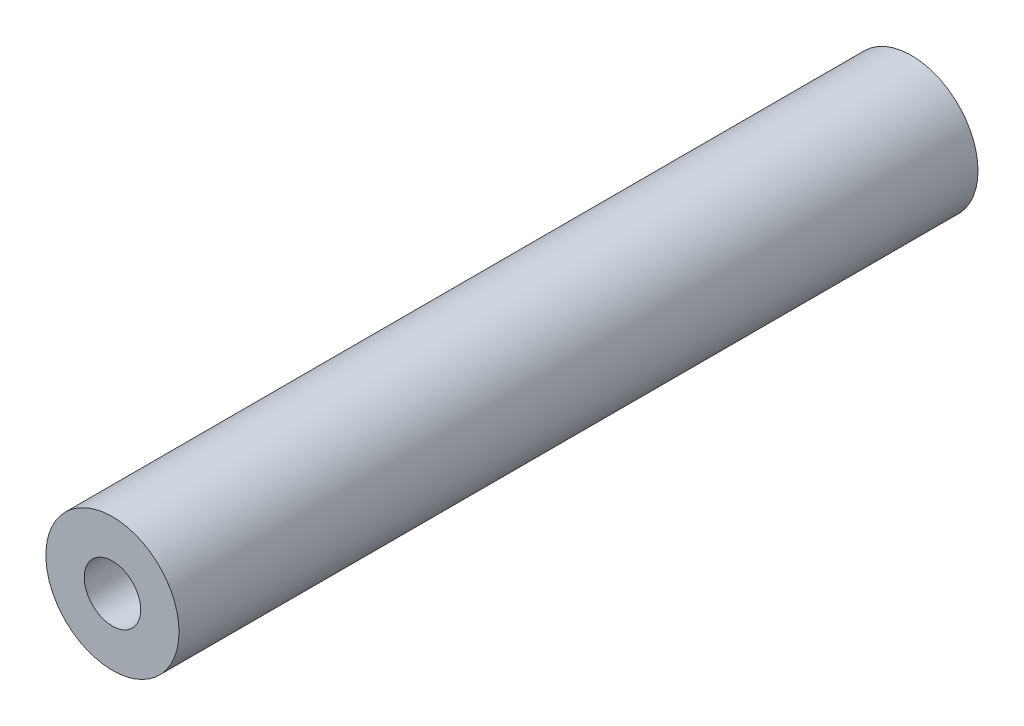
ISO-10303-21;
HEADER;
FILE_DESCRIPTION(('STEP AP214'),'2;1');
FILE_NAME('part.step','',(''),(''),'','','');
FILE_SCHEMA(('AUTOMOTIVE_DESIGN { 1 0 10303 214 1 1 1 1 }'));
ENDSEC;
DATA;
#1=APPLICATION_CONTEXT('core data for automotive mechanical design processes');
#2=APPLICATION_PROTOCOL_DEFINITION('international standard','automotive_design',2000,#1);
#3=PRODUCT_CONTEXT('',#1,'mechanical');
#4=PRODUCT('Part','Part','',(#3));
#5=PRODUCT_RELATED_PRODUCT_CATEGORY('part','',(#4));
#6=PRODUCT_DEFINITION_FORMATION('','',#4);
#7=PRODUCT_DEFINITION_CONTEXT('part definition',#1,'design');
#8=PRODUCT_DEFINITION('design','',#6,#7);
#9=PRODUCT_DEFINITION_SHAPE('','',#8);
#10=(LENGTH_UNIT() NAMED_UNIT(*) SI_UNIT(.MILLI.,.METRE.));
#11=(NAMED_UNIT(*) PLANE_ANGLE_UNIT() SI_UNIT($,.RADIAN.));
#12=(NAMED_UNIT(*) SI_UNIT($,.STERADIAN.) SOLID_ANGLE_UNIT());
#13=UNCERTAINTY_MEASURE_WITH_UNIT(LENGTH_MEASURE(1.E-05),#10,'distance_accuracy_value','');
#14=(GEOMETRIC_REPRESENTATION_CONTEXT(3) GLOBAL_UNCERTAINTY_ASSIGNED_CONTEXT((#13)) GLOBAL_UNIT_ASSIGNED_CONTEXT((#10,
#11,#12)) REPRESENTATION_CONTEXT('',''));
#15=CARTESIAN_POINT('',(0.,0.,0.));
#16=DIRECTION('',(0.,0.,1.));
#17=DIRECTION('',(1.,0.,0.));
#18=AXIS2_PLACEMENT_3D('',#15,#16,#17);
#19=CARTESIAN_POINT('',(0.,0.,57.15));
#20=DIRECTION('',(0.,0.,-1.));
#21=DIRECTION('',(-1.,0.,0.));
#22=AXIS2_PLACEMENT_3D('',#19,#20,#21);
#23=CYLINDRICAL_SURFACE('',#22,4.7625);
#24=CARTESIAN_POINT('',(0.,0.,57.15));
#25=DIRECTION('',(0.,0.,1.));
#26=DIRECTION('',(1.,0.,0.));
#27=AXIS2_PLACEMENT_3D('',#24,#25,#26);
#28=CIRCLE('',#27,4.7625);
#29=CARTESIAN_POINT('',(4.7625,0.,57.15));
#30=VERTEX_POINT('',#29);
#31=EDGE_CURVE('E10',#30,#30,#28,.T.);
#32=ORIENTED_EDGE('',*,*,#31,.F.);
#33=EDGE_LOOP('',(#32));
#34=FACE_BOUND('',#33,.T.);
#35=CARTESIAN_POINT('',(0.,0.,0.));
#36=DIRECTION('',(0.,0.,1.));
#37=DIRECTION('',(1.,0.,0.));
#38=AXIS2_PLACEMENT_3D('',#35,#36,#37);
#39=CIRCLE('',#38,4.7625);
#40=CARTESIAN_POINT('',(4.7625,0.,0.));
#41=VERTEX_POINT('',#40);
#42=EDGE_CURVE('E41',#41,#41,#39,.T.);
#43=ORIENTED_EDGE('',*,*,#42,.T.);
#44=EDGE_LOOP('',(#43));
#45=FACE_BOUND('',#44,.T.);
#46=ADVANCED_FACE('F38',(#34,#45),#23,.T.);
#47=CARTESIAN_POINT('',(0.,0.,57.15));
#48=DIRECTION('',(0.,0.,1.));
#49=DIRECTION('',(1.,0.,0.));
#50=AXIS2_PLACEMENT_3D('',#47,#48,#49);
#51=PLANE('',#50);
#52=CARTESIAN_POINT('',(0.,0.,57.15));
#53=DIRECTION('',(0.,0.,1.));
#54=DIRECTION('',(1.,0.,0.));
#55=AXIS2_PLACEMENT_3D('',#52,#53,#54);
#56=CIRCLE('',#55,2.01929999999998);
#57=CARTESIAN_POINT('',(2.01929999999998,0.,57.15));
#58=VERTEX_POINT('',#57);
#59=EDGE_CURVE('E52',#58,#58,#56,.T.);
#60=ORIENTED_EDGE('',*,*,#59,.F.);
#61=EDGE_LOOP('',(#60));
#62=FACE_BOUND('',#61,.T.);
#63=ORIENTED_EDGE('',*,*,#31,.T.);
#64=EDGE_LOOP('',(#63));
#65=FACE_BOUND('',#64,.T.);
#66=ADVANCED_FACE('F58',(#62,#65),#51,.T.);
#67=CARTESIAN_POINT('',(0.,0.,0.));
#68=DIRECTION('',(0.,0.,1.));
#69=DIRECTION('',(1.,0.,0.));
#70=AXIS2_PLACEMENT_3D('',#67,#68,#69);
#71=PLANE('',#70);
#72=CARTESIAN_POINT('',(0.,0.,0.));
#73=DIRECTION('',(0.,0.,1.));
#74=DIRECTION('',(1.,0.,0.));
#75=AXIS2_PLACEMENT_3D('',#72,#73,#74);
#76=CIRCLE('',#75,2.01929999999998);
#77=CARTESIAN_POINT('',(2.01929999999998,0.,0.));
#78=VERTEX_POINT('',#77);
#79=EDGE_CURVE('E48',#78,#78,#76,.T.);
#80=ORIENTED_EDGE('',*,*,#79,.T.);
#81=EDGE_LOOP('',(#80));
#82=FACE_BOUND('',#81,.T.);
#83=ORIENTED_EDGE('',*,*,#42,.F.);
#84=EDGE_LOOP('',(#83));
#85=FACE_BOUND('',#84,.T.);
#86=ADVANCED_FACE('F60',(#82,#85),#71,.F.);
#87=CARTESIAN_POINT('',(0.,0.,57.15));
#88=DIRECTION('',(0.,0.,1.));
#89=DIRECTION('',(1.,0.,0.));
#90=AXIS2_PLACEMENT_3D('',#87,#88,#89);
#91=CYLINDRICAL_SURFACE('',#90,2.01929999999998);
#92=ORIENTED_EDGE('',*,*,#79,.F.);
#93=EDGE_LOOP('',(#92));
#94=FACE_BOUND('',#93,.T.);
#95=ORIENTED_EDGE('',*,*,#59,.T.);
#96=EDGE_LOOP('',(#95));
#97=FACE_BOUND('',#96,.T.);
#98=ADVANCED_FACE('F56',(#94,#97),#91,.F.);
#99=CLOSED_SHELL('',(#46,#66,#86,#98));
#100=MANIFOLD_SOLID_BREP('B2',#99);
#101=ADVANCED_BREP_SHAPE_REPRESENTATION('',(#18,#100),#14);
#102=SHAPE_DEFINITION_REPRESENTATION(#9,#101);
ENDSEC;
END-ISO-10303-21;
